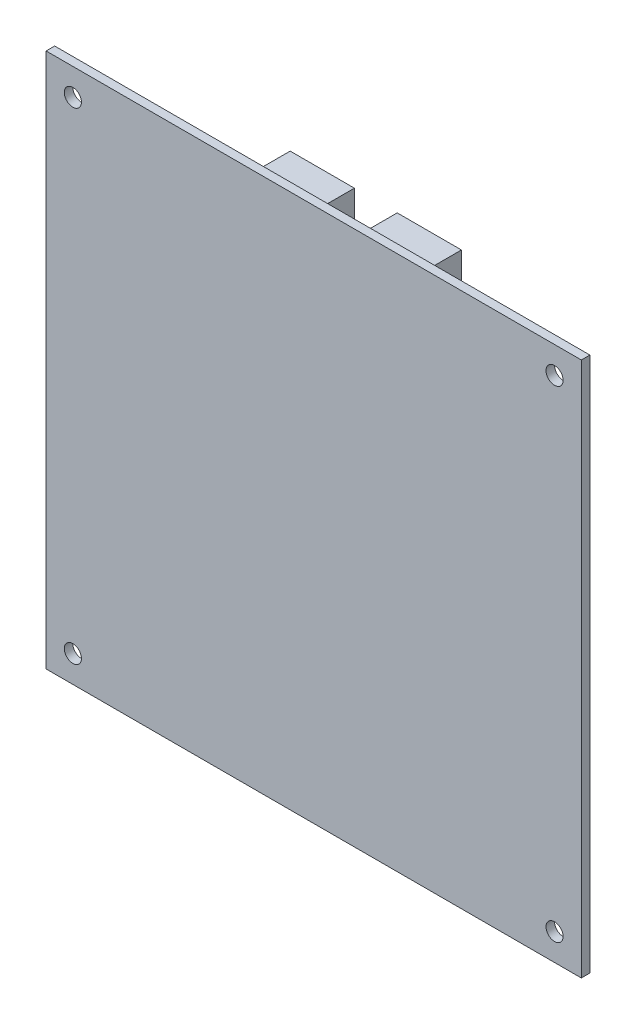
ISO-10303-21;
HEADER;
FILE_DESCRIPTION(('STEP AP214'),'2;1');
FILE_NAME('part.step','',(''),(''),'','','');
FILE_SCHEMA(('AUTOMOTIVE_DESIGN { 1 0 10303 214 1 1 1 1 }'));
ENDSEC;
DATA;
#1=APPLICATION_CONTEXT('core data for automotive mechanical design processes');
#2=APPLICATION_PROTOCOL_DEFINITION('international standard','automotive_design',2000,#1);
#3=PRODUCT_CONTEXT('',#1,'mechanical');
#4=PRODUCT('Part','Part','',(#3));
#5=PRODUCT_RELATED_PRODUCT_CATEGORY('part','',(#4));
#6=PRODUCT_DEFINITION_FORMATION('','',#4);
#7=PRODUCT_DEFINITION_CONTEXT('part definition',#1,'design');
#8=PRODUCT_DEFINITION('design','',#6,#7);
#9=PRODUCT_DEFINITION_SHAPE('','',#8);
#10=(LENGTH_UNIT() NAMED_UNIT(*) SI_UNIT(.MILLI.,.METRE.));
#11=(NAMED_UNIT(*) PLANE_ANGLE_UNIT() SI_UNIT($,.RADIAN.));
#12=(NAMED_UNIT(*) SI_UNIT($,.STERADIAN.) SOLID_ANGLE_UNIT());
#13=UNCERTAINTY_MEASURE_WITH_UNIT(LENGTH_MEASURE(1.E-05),#10,'distance_accuracy_value','');
#14=(GEOMETRIC_REPRESENTATION_CONTEXT(3) GLOBAL_UNCERTAINTY_ASSIGNED_CONTEXT((#13)) GLOBAL_UNIT_ASSIGNED_CONTEXT((#10,
#11,#12)) REPRESENTATION_CONTEXT('',''));
#15=CARTESIAN_POINT('',(0.,0.,0.));
#16=DIRECTION('',(0.,0.,1.));
#17=DIRECTION('',(1.,0.,0.));
#18=AXIS2_PLACEMENT_3D('',#15,#16,#17);
#19=CARTESIAN_POINT('',(0.,0.,0.));
#20=DIRECTION('',(0.,0.,1.));
#21=DIRECTION('',(1.,0.,0.));
#22=AXIS2_PLACEMENT_3D('',#19,#20,#21);
#23=PLANE('',#22);
#24=DIRECTION('',(0.,-1.,0.));
#25=VECTOR('',#24,1.);
#26=CARTESIAN_POINT('',(34.,95.,0.));
#27=LINE('',#26,#25);
#28=CARTESIAN_POINT('',(34.,95.,0.));
#29=VERTEX_POINT('',#28);
#30=CARTESIAN_POINT('',(34.,85.,0.));
#31=VERTEX_POINT('',#30);
#32=EDGE_CURVE('E273',#29,#31,#27,.T.);
#33=ORIENTED_EDGE('',*,*,#32,.T.);
#34=DIRECTION('',(1.,0.,0.));
#35=VECTOR('',#34,1.);
#36=CARTESIAN_POINT('',(34.,85.,0.));
#37=LINE('',#36,#35);
#38=CARTESIAN_POINT('',(46.,85.,0.));
#39=VERTEX_POINT('',#38);
#40=EDGE_CURVE('E280',#31,#39,#37,.T.);
#41=ORIENTED_EDGE('',*,*,#40,.T.);
#42=DIRECTION('',(0.,1.,0.));
#43=VECTOR('',#42,1.);
#44=CARTESIAN_POINT('',(46.,85.,0.));
#45=LINE('',#44,#43);
#46=CARTESIAN_POINT('',(46.,95.,0.));
#47=VERTEX_POINT('',#46);
#48=EDGE_CURVE('E281',#39,#47,#45,.T.);
#49=ORIENTED_EDGE('',*,*,#48,.T.);
#50=DIRECTION('',(-1.,0.,0.));
#51=VECTOR('',#50,1.);
#52=CARTESIAN_POINT('',(46.,95.,0.));
#53=LINE('',#52,#51);
#54=EDGE_CURVE('E283',#47,#29,#53,.T.);
#55=ORIENTED_EDGE('',*,*,#54,.T.);
#56=EDGE_LOOP('',(#33,#41,#49,#55));
#57=FACE_BOUND('',#56,.T.);
#58=DIRECTION('',(0.,-1.,0.));
#59=VECTOR('',#58,1.);
#60=CARTESIAN_POINT('',(34.,73.,0.));
#61=LINE('',#60,#59);
#62=CARTESIAN_POINT('',(34.,73.,0.));
#63=VERTEX_POINT('',#62);
#64=CARTESIAN_POINT('',(34.,26.,0.));
#65=VERTEX_POINT('',#64);
#66=EDGE_CURVE('E356',#63,#65,#61,.T.);
#67=ORIENTED_EDGE('',*,*,#66,.T.);
#68=DIRECTION('',(1.,0.,0.));
#69=VECTOR('',#68,1.);
#70=CARTESIAN_POINT('',(34.,26.,0.));
#71=LINE('',#70,#69);
#72=CARTESIAN_POINT('',(66.,26.,0.));
#73=VERTEX_POINT('',#72);
#74=EDGE_CURVE('E358',#65,#73,#71,.T.);
#75=ORIENTED_EDGE('',*,*,#74,.T.);
#76=DIRECTION('',(0.,1.,0.));
#77=VECTOR('',#76,1.);
#78=CARTESIAN_POINT('',(66.,26.,0.));
#79=LINE('',#78,#77);
#80=CARTESIAN_POINT('',(66.,73.,0.));
#81=VERTEX_POINT('',#80);
#82=EDGE_CURVE('E361',#73,#81,#79,.T.);
#83=ORIENTED_EDGE('',*,*,#82,.T.);
#84=DIRECTION('',(-1.,0.,0.));
#85=VECTOR('',#84,1.);
#86=CARTESIAN_POINT('',(66.,73.,0.));
#87=LINE('',#86,#85);
#88=EDGE_CURVE('E368',#81,#63,#87,.T.);
#89=ORIENTED_EDGE('',*,*,#88,.T.);
#90=EDGE_LOOP('',(#67,#75,#83,#89));
#91=FACE_BOUND('',#90,.T.);
#92=CARTESIAN_POINT('',(95.,95.,0.));
#93=DIRECTION('',(0.,0.,1.));
#94=DIRECTION('',(1.,0.,0.));
#95=AXIS2_PLACEMENT_3D('',#92,#93,#94);
#96=CIRCLE('',#95,1.6);
#97=CARTESIAN_POINT('',(96.6,95.,0.));
#98=VERTEX_POINT('',#97);
#99=EDGE_CURVE('E485',#98,#98,#96,.T.);
#100=ORIENTED_EDGE('',*,*,#99,.T.);
#101=EDGE_LOOP('',(#100));
#102=FACE_BOUND('',#101,.T.);
#103=CARTESIAN_POINT('',(5.,95.,0.));
#104=DIRECTION('',(0.,0.,1.));
#105=DIRECTION('',(1.,0.,0.));
#106=AXIS2_PLACEMENT_3D('',#103,#104,#105);
#107=CIRCLE('',#106,1.6);
#108=CARTESIAN_POINT('',(6.6,95.,0.));
#109=VERTEX_POINT('',#108);
#110=EDGE_CURVE('E490',#109,#109,#107,.T.);
#111=ORIENTED_EDGE('',*,*,#110,.T.);
#112=EDGE_LOOP('',(#111));
#113=FACE_BOUND('',#112,.T.);
#114=CARTESIAN_POINT('',(95.,5.,0.));
#115=DIRECTION('',(0.,0.,1.));
#116=DIRECTION('',(1.,0.,0.));
#117=AXIS2_PLACEMENT_3D('',#114,#115,#116);
#118=CIRCLE('',#117,1.6);
#119=CARTESIAN_POINT('',(96.6,5.,0.));
#120=VERTEX_POINT('',#119);
#121=EDGE_CURVE('E494',#120,#120,#118,.T.);
#122=ORIENTED_EDGE('',*,*,#121,.T.);
#123=EDGE_LOOP('',(#122));
#124=FACE_BOUND('',#123,.T.);
#125=CARTESIAN_POINT('',(5.,5.,0.));
#126=DIRECTION('',(0.,0.,1.));
#127=DIRECTION('',(1.,0.,0.));
#128=AXIS2_PLACEMENT_3D('',#125,#126,#127);
#129=CIRCLE('',#128,1.6);
#130=CARTESIAN_POINT('',(6.6,5.,0.));
#131=VERTEX_POINT('',#130);
#132=EDGE_CURVE('E504',#131,#131,#129,.T.);
#133=ORIENTED_EDGE('',*,*,#132,.T.);
#134=EDGE_LOOP('',(#133));
#135=FACE_BOUND('',#134,.T.);
#136=DIRECTION('',(0.,-1.,0.));
#137=VECTOR('',#136,1.);
#138=CARTESIAN_POINT('',(0.,100.,0.));
#139=LINE('',#138,#137);
#140=CARTESIAN_POINT('',(0.,100.,0.));
#141=VERTEX_POINT('',#140);
#142=CARTESIAN_POINT('',(0.,0.,0.));
#143=VERTEX_POINT('',#142);
#144=EDGE_CURVE('E512',#141,#143,#139,.T.);
#145=ORIENTED_EDGE('',*,*,#144,.F.);
#146=DIRECTION('',(-1.,0.,0.));
#147=VECTOR('',#146,1.);
#148=CARTESIAN_POINT('',(100.,100.,0.));
#149=LINE('',#148,#147);
#150=CARTESIAN_POINT('',(100.,100.,0.));
#151=VERTEX_POINT('',#150);
#152=EDGE_CURVE('E520',#151,#141,#149,.T.);
#153=ORIENTED_EDGE('',*,*,#152,.F.);
#154=DIRECTION('',(0.,1.,0.));
#155=VECTOR('',#154,1.);
#156=CARTESIAN_POINT('',(100.,0.,0.));
#157=LINE('',#156,#155);
#158=CARTESIAN_POINT('',(100.,0.,0.));
#159=VERTEX_POINT('',#158);
#160=EDGE_CURVE('E536',#159,#151,#157,.T.);
#161=ORIENTED_EDGE('',*,*,#160,.F.);
#162=DIRECTION('',(1.,0.,0.));
#163=VECTOR('',#162,1.);
#164=CARTESIAN_POINT('',(0.,0.,0.));
#165=LINE('',#164,#163);
#166=EDGE_CURVE('E531',#143,#159,#165,.T.);
#167=ORIENTED_EDGE('',*,*,#166,.F.);
#168=EDGE_LOOP('',(#145,#153,#161,#167));
#169=FACE_BOUND('',#168,.T.);
#170=DIRECTION('',(-1.,0.,0.));
#171=VECTOR('',#170,1.);
#172=CARTESIAN_POINT('',(30.,78.,0.));
#173=LINE('',#172,#171);
#174=CARTESIAN_POINT('',(30.,78.,0.));
#175=VERTEX_POINT('',#174);
#176=CARTESIAN_POINT('',(26.,78.,0.));
#177=VERTEX_POINT('',#176);
#178=EDGE_CURVE('E451',#175,#177,#173,.T.);
#179=ORIENTED_EDGE('',*,*,#178,.T.);
#180=DIRECTION('',(0.,-1.,0.));
#181=VECTOR('',#180,1.);
#182=CARTESIAN_POINT('',(26.,78.,0.));
#183=LINE('',#182,#181);
#184=CARTESIAN_POINT('',(26.,20.,0.));
#185=VERTEX_POINT('',#184);
#186=EDGE_CURVE('E437',#177,#185,#183,.T.);
#187=ORIENTED_EDGE('',*,*,#186,.T.);
#188=DIRECTION('',(1.,0.,0.));
#189=VECTOR('',#188,1.);
#190=CARTESIAN_POINT('',(26.,20.,0.));
#191=LINE('',#190,#189);
#192=CARTESIAN_POINT('',(30.,20.,0.));
#193=VERTEX_POINT('',#192);
#194=EDGE_CURVE('E445',#185,#193,#191,.T.);
#195=ORIENTED_EDGE('',*,*,#194,.T.);
#196=DIRECTION('',(0.,1.,0.));
#197=VECTOR('',#196,1.);
#198=CARTESIAN_POINT('',(30.,20.,0.));
#199=LINE('',#198,#197);
#200=EDGE_CURVE('E447',#193,#175,#199,.T.);
#201=ORIENTED_EDGE('',*,*,#200,.T.);
#202=EDGE_LOOP('',(#179,#187,#195,#201));
#203=FACE_BOUND('',#202,.T.);
#204=DIRECTION('',(0.,-1.,0.));
#205=VECTOR('',#204,1.);
#206=CARTESIAN_POINT('',(70.,78.,0.));
#207=LINE('',#206,#205);
#208=CARTESIAN_POINT('',(70.,78.,0.));
#209=VERTEX_POINT('',#208);
#210=CARTESIAN_POINT('',(70.,20.,0.));
#211=VERTEX_POINT('',#210);
#212=EDGE_CURVE('E397',#209,#211,#207,.T.);
#213=ORIENTED_EDGE('',*,*,#212,.T.);
#214=DIRECTION('',(1.,0.,0.));
#215=VECTOR('',#214,1.);
#216=CARTESIAN_POINT('',(70.,20.,0.));
#217=LINE('',#216,#215);
#218=CARTESIAN_POINT('',(74.,20.,0.));
#219=VERTEX_POINT('',#218);
#220=EDGE_CURVE('E400',#211,#219,#217,.T.);
#221=ORIENTED_EDGE('',*,*,#220,.T.);
#222=DIRECTION('',(0.,1.,0.));
#223=VECTOR('',#222,1.);
#224=CARTESIAN_POINT('',(74.,20.,0.));
#225=LINE('',#224,#223);
#226=CARTESIAN_POINT('',(74.,78.,0.));
#227=VERTEX_POINT('',#226);
#228=EDGE_CURVE('E404',#219,#227,#225,.T.);
#229=ORIENTED_EDGE('',*,*,#228,.T.);
#230=DIRECTION('',(-1.,0.,0.));
#231=VECTOR('',#230,1.);
#232=CARTESIAN_POINT('',(74.,78.,0.));
#233=LINE('',#232,#231);
#234=EDGE_CURVE('E407',#227,#209,#233,.T.);
#235=ORIENTED_EDGE('',*,*,#234,.T.);
#236=EDGE_LOOP('',(#213,#221,#229,#235));
#237=FACE_BOUND('',#236,.T.);
#238=DIRECTION('',(0.,-1.,0.));
#239=VECTOR('',#238,1.);
#240=CARTESIAN_POINT('',(40.,13.,0.));
#241=LINE('',#240,#239);
#242=CARTESIAN_POINT('',(40.,13.,0.));
#243=VERTEX_POINT('',#242);
#244=CARTESIAN_POINT('',(40.,3.,0.));
#245=VERTEX_POINT('',#244);
#246=EDGE_CURVE('E312',#243,#245,#241,.T.);
#247=ORIENTED_EDGE('',*,*,#246,.T.);
#248=DIRECTION('',(1.,0.,0.));
#249=VECTOR('',#248,1.);
#250=CARTESIAN_POINT('',(40.,3.,0.));
#251=LINE('',#250,#249);
#252=CARTESIAN_POINT('',(60.,3.,0.));
#253=VERTEX_POINT('',#252);
#254=EDGE_CURVE('E318',#245,#253,#251,.T.);
#255=ORIENTED_EDGE('',*,*,#254,.T.);
#256=DIRECTION('',(0.,1.,0.));
#257=VECTOR('',#256,1.);
#258=CARTESIAN_POINT('',(60.,3.,0.));
#259=LINE('',#258,#257);
#260=CARTESIAN_POINT('',(60.,13.,0.));
#261=VERTEX_POINT('',#260);
#262=EDGE_CURVE('E325',#253,#261,#259,.T.);
#263=ORIENTED_EDGE('',*,*,#262,.T.);
#264=DIRECTION('',(-1.,0.,0.));
#265=VECTOR('',#264,1.);
#266=CARTESIAN_POINT('',(60.,13.,0.));
#267=LINE('',#266,#265);
#268=EDGE_CURVE('E324',#261,#243,#267,.T.);
#269=ORIENTED_EDGE('',*,*,#268,.T.);
#270=EDGE_LOOP('',(#247,#255,#263,#269));
#271=FACE_BOUND('',#270,.T.);
#272=DIRECTION('',(0.,-1.,0.));
#273=VECTOR('',#272,1.);
#274=CARTESIAN_POINT('',(54.,95.,0.));
#275=LINE('',#274,#273);
#276=CARTESIAN_POINT('',(54.,95.,0.));
#277=VERTEX_POINT('',#276);
#278=CARTESIAN_POINT('',(54.,85.,0.));
#279=VERTEX_POINT('',#278);
#280=EDGE_CURVE('E61',#277,#279,#275,.T.);
#281=ORIENTED_EDGE('',*,*,#280,.T.);
#282=DIRECTION('',(1.,0.,0.));
#283=VECTOR('',#282,1.);
#284=CARTESIAN_POINT('',(54.,85.,0.));
#285=LINE('',#284,#283);
#286=CARTESIAN_POINT('',(66.,85.,0.));
#287=VERTEX_POINT('',#286);
#288=EDGE_CURVE('E65',#279,#287,#285,.T.);
#289=ORIENTED_EDGE('',*,*,#288,.T.);
#290=DIRECTION('',(0.,1.,0.));
#291=VECTOR('',#290,1.);
#292=CARTESIAN_POINT('',(66.,85.,0.));
#293=LINE('',#292,#291);
#294=CARTESIAN_POINT('',(66.,95.,0.));
#295=VERTEX_POINT('',#294);
#296=EDGE_CURVE('E227',#287,#295,#293,.T.);
#297=ORIENTED_EDGE('',*,*,#296,.T.);
#298=DIRECTION('',(-1.,0.,0.));
#299=VECTOR('',#298,1.);
#300=CARTESIAN_POINT('',(66.,95.,0.));
#301=LINE('',#300,#299);
#302=EDGE_CURVE('E230',#295,#277,#301,.T.);
#303=ORIENTED_EDGE('',*,*,#302,.T.);
#304=EDGE_LOOP('',(#281,#289,#297,#303));
#305=FACE_BOUND('',#304,.T.);
#306=ADVANCED_FACE('F44',(#57,#91,#102,#113,#124,#135,#169,#203,#237,#271,#305),#23,.F.);
#307=CARTESIAN_POINT('',(0.,0.,1.6));
#308=DIRECTION('',(0.,0.,1.));
#309=DIRECTION('',(1.,0.,0.));
#310=AXIS2_PLACEMENT_3D('',#307,#308,#309);
#311=PLANE('',#310);
#312=CARTESIAN_POINT('',(5.,95.,1.6));
#313=DIRECTION('',(0.,0.,1.));
#314=DIRECTION('',(1.,0.,0.));
#315=AXIS2_PLACEMENT_3D('',#312,#313,#314);
#316=CIRCLE('',#315,1.6);
#317=CARTESIAN_POINT('',(6.6,95.,1.6));
#318=VERTEX_POINT('',#317);
#319=EDGE_CURVE('E491',#318,#318,#316,.T.);
#320=ORIENTED_EDGE('',*,*,#319,.F.);
#321=EDGE_LOOP('',(#320));
#322=FACE_BOUND('',#321,.T.);
#323=CARTESIAN_POINT('',(5.,5.,1.6));
#324=DIRECTION('',(0.,0.,1.));
#325=DIRECTION('',(1.,0.,0.));
#326=AXIS2_PLACEMENT_3D('',#323,#324,#325);
#327=CIRCLE('',#326,1.6);
#328=CARTESIAN_POINT('',(6.6,5.,1.6));
#329=VERTEX_POINT('',#328);
#330=EDGE_CURVE('E507',#329,#329,#327,.T.);
#331=ORIENTED_EDGE('',*,*,#330,.F.);
#332=EDGE_LOOP('',(#331));
#333=FACE_BOUND('',#332,.T.);
#334=DIRECTION('',(0.,-1.,0.));
#335=VECTOR('',#334,1.);
#336=CARTESIAN_POINT('',(0.,100.,1.6));
#337=LINE('',#336,#335);
#338=CARTESIAN_POINT('',(0.,100.,1.6));
#339=VERTEX_POINT('',#338);
#340=CARTESIAN_POINT('',(0.,0.,1.6));
#341=VERTEX_POINT('',#340);
#342=EDGE_CURVE('E513',#339,#341,#337,.T.);
#343=ORIENTED_EDGE('',*,*,#342,.T.);
#344=DIRECTION('',(1.,0.,0.));
#345=VECTOR('',#344,1.);
#346=CARTESIAN_POINT('',(0.,0.,1.6));
#347=LINE('',#346,#345);
#348=CARTESIAN_POINT('',(100.,0.,1.6));
#349=VERTEX_POINT('',#348);
#350=EDGE_CURVE('E518',#341,#349,#347,.T.);
#351=ORIENTED_EDGE('',*,*,#350,.T.);
#352=DIRECTION('',(0.,1.,0.));
#353=VECTOR('',#352,1.);
#354=CARTESIAN_POINT('',(100.,0.,1.6));
#355=LINE('',#354,#353);
#356=CARTESIAN_POINT('',(100.,100.,1.6));
#357=VERTEX_POINT('',#356);
#358=EDGE_CURVE('E524',#349,#357,#355,.T.);
#359=ORIENTED_EDGE('',*,*,#358,.T.);
#360=DIRECTION('',(-1.,0.,0.));
#361=VECTOR('',#360,1.);
#362=CARTESIAN_POINT('',(100.,100.,1.6));
#363=LINE('',#362,#361);
#364=EDGE_CURVE('E528',#357,#339,#363,.T.);
#365=ORIENTED_EDGE('',*,*,#364,.T.);
#366=EDGE_LOOP('',(#343,#351,#359,#365));
#367=FACE_BOUND('',#366,.T.);
#368=CARTESIAN_POINT('',(95.,5.,1.6));
#369=DIRECTION('',(0.,0.,1.));
#370=DIRECTION('',(1.,0.,0.));
#371=AXIS2_PLACEMENT_3D('',#368,#369,#370);
#372=CIRCLE('',#371,1.6);
#373=CARTESIAN_POINT('',(96.6,5.,1.6));
#374=VERTEX_POINT('',#373);
#375=EDGE_CURVE('E496',#374,#374,#372,.T.);
#376=ORIENTED_EDGE('',*,*,#375,.F.);
#377=EDGE_LOOP('',(#376));
#378=FACE_BOUND('',#377,.T.);
#379=CARTESIAN_POINT('',(95.,95.,1.6));
#380=DIRECTION('',(0.,0.,1.));
#381=DIRECTION('',(1.,0.,0.));
#382=AXIS2_PLACEMENT_3D('',#379,#380,#381);
#383=CIRCLE('',#382,1.6);
#384=CARTESIAN_POINT('',(96.6,95.,1.6));
#385=VERTEX_POINT('',#384);
#386=EDGE_CURVE('E483',#385,#385,#383,.T.);
#387=ORIENTED_EDGE('',*,*,#386,.F.);
#388=EDGE_LOOP('',(#387));
#389=FACE_BOUND('',#388,.T.);
#390=ADVANCED_FACE('F566',(#322,#333,#367,#378,#389),#311,.T.);
#391=CARTESIAN_POINT('',(0.,100.,1.6));
#392=DIRECTION('',(1.,0.,0.));
#393=DIRECTION('',(0.,0.,-1.));
#394=AXIS2_PLACEMENT_3D('',#391,#392,#393);
#395=PLANE('',#394);
#396=ORIENTED_EDGE('',*,*,#144,.T.);
#397=DIRECTION('',(0.,0.,-1.));
#398=VECTOR('',#397,1.);
#399=CARTESIAN_POINT('',(0.,0.,1.6));
#400=LINE('',#399,#398);
#401=EDGE_CURVE('E11',#341,#143,#400,.T.);
#402=ORIENTED_EDGE('',*,*,#401,.F.);
#403=ORIENTED_EDGE('',*,*,#342,.F.);
#404=DIRECTION('',(0.,0.,-1.));
#405=VECTOR('',#404,1.);
#406=CARTESIAN_POINT('',(0.,100.,1.6));
#407=LINE('',#406,#405);
#408=EDGE_CURVE('E530',#339,#141,#407,.T.);
#409=ORIENTED_EDGE('',*,*,#408,.T.);
#410=EDGE_LOOP('',(#396,#402,#403,#409));
#411=FACE_BOUND('',#410,.T.);
#412=ADVANCED_FACE('F50',(#411),#395,.F.);
#413=CARTESIAN_POINT('',(0.,0.,1.6));
#414=DIRECTION('',(0.,1.,0.));
#415=DIRECTION('',(0.,0.,1.));
#416=AXIS2_PLACEMENT_3D('',#413,#414,#415);
#417=PLANE('',#416);
#418=ORIENTED_EDGE('',*,*,#166,.T.);
#419=DIRECTION('',(0.,0.,-1.));
#420=VECTOR('',#419,1.);
#421=CARTESIAN_POINT('',(100.,0.,1.6));
#422=LINE('',#421,#420);
#423=EDGE_CURVE('E53',#349,#159,#422,.T.);
#424=ORIENTED_EDGE('',*,*,#423,.F.);
#425=ORIENTED_EDGE('',*,*,#350,.F.);
#426=ORIENTED_EDGE('',*,*,#401,.T.);
#427=EDGE_LOOP('',(#418,#424,#425,#426));
#428=FACE_BOUND('',#427,.T.);
#429=ADVANCED_FACE('F568',(#428),#417,.F.);
#430=CARTESIAN_POINT('',(100.,0.,1.6));
#431=DIRECTION('',(-1.,0.,0.));
#432=DIRECTION('',(0.,0.,1.));
#433=AXIS2_PLACEMENT_3D('',#430,#431,#432);
#434=PLANE('',#433);
#435=ORIENTED_EDGE('',*,*,#160,.T.);
#436=DIRECTION('',(0.,0.,-1.));
#437=VECTOR('',#436,1.);
#438=CARTESIAN_POINT('',(100.,100.,1.6));
#439=LINE('',#438,#437);
#440=EDGE_CURVE('E542',#357,#151,#439,.T.);
#441=ORIENTED_EDGE('',*,*,#440,.F.);
#442=ORIENTED_EDGE('',*,*,#358,.F.);
#443=ORIENTED_EDGE('',*,*,#423,.T.);
#444=EDGE_LOOP('',(#435,#441,#442,#443));
#445=FACE_BOUND('',#444,.T.);
#446=ADVANCED_FACE('F554',(#445),#434,.F.);
#447=CARTESIAN_POINT('',(100.,100.,1.6));
#448=DIRECTION('',(0.,-1.,0.));
#449=DIRECTION('',(0.,0.,-1.));
#450=AXIS2_PLACEMENT_3D('',#447,#448,#449);
#451=PLANE('',#450);
#452=ORIENTED_EDGE('',*,*,#152,.T.);
#453=ORIENTED_EDGE('',*,*,#408,.F.);
#454=ORIENTED_EDGE('',*,*,#364,.F.);
#455=ORIENTED_EDGE('',*,*,#440,.T.);
#456=EDGE_LOOP('',(#452,#453,#454,#455));
#457=FACE_BOUND('',#456,.T.);
#458=ADVANCED_FACE('F562',(#457),#451,.F.);
#459=CARTESIAN_POINT('',(5.,5.,1.6));
#460=DIRECTION('',(0.,0.,-1.));
#461=DIRECTION('',(-1.,0.,0.));
#462=AXIS2_PLACEMENT_3D('',#459,#460,#461);
#463=CYLINDRICAL_SURFACE('',#462,1.6);
#464=ORIENTED_EDGE('',*,*,#330,.T.);
#465=EDGE_LOOP('',(#464));
#466=FACE_BOUND('',#465,.T.);
#467=ORIENTED_EDGE('',*,*,#132,.F.);
#468=EDGE_LOOP('',(#467));
#469=FACE_BOUND('',#468,.T.);
#470=ADVANCED_FACE('F591',(#466,#469),#463,.F.);
#471=CARTESIAN_POINT('',(95.,5.,1.6));
#472=DIRECTION('',(0.,0.,-1.));
#473=DIRECTION('',(-1.,0.,0.));
#474=AXIS2_PLACEMENT_3D('',#471,#472,#473);
#475=CYLINDRICAL_SURFACE('',#474,1.6);
#476=ORIENTED_EDGE('',*,*,#375,.T.);
#477=EDGE_LOOP('',(#476));
#478=FACE_BOUND('',#477,.T.);
#479=ORIENTED_EDGE('',*,*,#121,.F.);
#480=EDGE_LOOP('',(#479));
#481=FACE_BOUND('',#480,.T.);
#482=ADVANCED_FACE('F594',(#478,#481),#475,.F.);
#483=CARTESIAN_POINT('',(5.,95.,1.6));
#484=DIRECTION('',(0.,0.,-1.));
#485=DIRECTION('',(-1.,0.,0.));
#486=AXIS2_PLACEMENT_3D('',#483,#484,#485);
#487=CYLINDRICAL_SURFACE('',#486,1.6);
#488=ORIENTED_EDGE('',*,*,#319,.T.);
#489=EDGE_LOOP('',(#488));
#490=FACE_BOUND('',#489,.T.);
#491=ORIENTED_EDGE('',*,*,#110,.F.);
#492=EDGE_LOOP('',(#491));
#493=FACE_BOUND('',#492,.T.);
#494=ADVANCED_FACE('F599',(#490,#493),#487,.F.);
#495=CARTESIAN_POINT('',(95.,95.,1.6));
#496=DIRECTION('',(0.,0.,-1.));
#497=DIRECTION('',(-1.,0.,0.));
#498=AXIS2_PLACEMENT_3D('',#495,#496,#497);
#499=CYLINDRICAL_SURFACE('',#498,1.6);
#500=ORIENTED_EDGE('',*,*,#386,.T.);
#501=EDGE_LOOP('',(#500));
#502=FACE_BOUND('',#501,.T.);
#503=ORIENTED_EDGE('',*,*,#99,.F.);
#504=EDGE_LOOP('',(#503));
#505=FACE_BOUND('',#504,.T.);
#506=ADVANCED_FACE('F610',(#502,#505),#499,.F.);
#507=CARTESIAN_POINT('',(26.,78.,0.));
#508=DIRECTION('',(1.,0.,0.));
#509=DIRECTION('',(0.,0.,-1.));
#510=AXIS2_PLACEMENT_3D('',#507,#508,#509);
#511=PLANE('',#510);
#512=DIRECTION('',(0.,-1.,0.));
#513=VECTOR('',#512,1.);
#514=CARTESIAN_POINT('',(26.,78.,-8.));
#515=LINE('',#514,#513);
#516=CARTESIAN_POINT('',(26.,78.,-8.));
#517=VERTEX_POINT('',#516);
#518=CARTESIAN_POINT('',(26.,20.,-8.));
#519=VERTEX_POINT('',#518);
#520=EDGE_CURVE('E440',#517,#519,#515,.T.);
#521=ORIENTED_EDGE('',*,*,#520,.T.);
#522=DIRECTION('',(0.,0.,-1.));
#523=VECTOR('',#522,1.);
#524=CARTESIAN_POINT('',(26.,20.,0.));
#525=LINE('',#524,#523);
#526=EDGE_CURVE('E476',#185,#519,#525,.T.);
#527=ORIENTED_EDGE('',*,*,#526,.F.);
#528=ORIENTED_EDGE('',*,*,#186,.F.);
#529=DIRECTION('',(0.,0.,-1.));
#530=VECTOR('',#529,1.);
#531=CARTESIAN_POINT('',(26.,78.,0.));
#532=LINE('',#531,#530);
#533=EDGE_CURVE('E455',#177,#517,#532,.T.);
#534=ORIENTED_EDGE('',*,*,#533,.T.);
#535=EDGE_LOOP('',(#521,#527,#528,#534));
#536=FACE_BOUND('',#535,.T.);
#537=ADVANCED_FACE('F611',(#536),#511,.F.);
#538=CARTESIAN_POINT('',(26.,20.,0.));
#539=DIRECTION('',(0.,1.,0.));
#540=DIRECTION('',(0.,0.,1.));
#541=AXIS2_PLACEMENT_3D('',#538,#539,#540);
#542=PLANE('',#541);
#543=DIRECTION('',(1.,0.,0.));
#544=VECTOR('',#543,1.);
#545=CARTESIAN_POINT('',(26.,20.,-8.));
#546=LINE('',#545,#544);
#547=CARTESIAN_POINT('',(30.,20.,-8.));
#548=VERTEX_POINT('',#547);
#549=EDGE_CURVE('E459',#519,#548,#546,.T.);
#550=ORIENTED_EDGE('',*,*,#549,.T.);
#551=DIRECTION('',(0.,0.,-1.));
#552=VECTOR('',#551,1.);
#553=CARTESIAN_POINT('',(30.,20.,0.));
#554=LINE('',#553,#552);
#555=EDGE_CURVE('E475',#193,#548,#554,.T.);
#556=ORIENTED_EDGE('',*,*,#555,.F.);
#557=ORIENTED_EDGE('',*,*,#194,.F.);
#558=ORIENTED_EDGE('',*,*,#526,.T.);
#559=EDGE_LOOP('',(#550,#556,#557,#558));
#560=FACE_BOUND('',#559,.T.);
#561=ADVANCED_FACE('F615',(#560),#542,.F.);
#562=CARTESIAN_POINT('',(30.,20.,0.));
#563=DIRECTION('',(-1.,0.,0.));
#564=DIRECTION('',(0.,0.,1.));
#565=AXIS2_PLACEMENT_3D('',#562,#563,#564);
#566=PLANE('',#565);
#567=DIRECTION('',(0.,1.,0.));
#568=VECTOR('',#567,1.);
#569=CARTESIAN_POINT('',(30.,20.,-8.));
#570=LINE('',#569,#568);
#571=CARTESIAN_POINT('',(30.,78.,-8.));
#572=VERTEX_POINT('',#571);
#573=EDGE_CURVE('E462',#548,#572,#570,.T.);
#574=ORIENTED_EDGE('',*,*,#573,.T.);
#575=DIRECTION('',(0.,0.,-1.));
#576=VECTOR('',#575,1.);
#577=CARTESIAN_POINT('',(30.,78.,0.));
#578=LINE('',#577,#576);
#579=EDGE_CURVE('E470',#175,#572,#578,.T.);
#580=ORIENTED_EDGE('',*,*,#579,.F.);
#581=ORIENTED_EDGE('',*,*,#200,.F.);
#582=ORIENTED_EDGE('',*,*,#555,.T.);
#583=EDGE_LOOP('',(#574,#580,#581,#582));
#584=FACE_BOUND('',#583,.T.);
#585=ADVANCED_FACE('F618',(#584),#566,.F.);
#586=CARTESIAN_POINT('',(30.,78.,0.));
#587=DIRECTION('',(0.,-1.,0.));
#588=DIRECTION('',(0.,0.,-1.));
#589=AXIS2_PLACEMENT_3D('',#586,#587,#588);
#590=PLANE('',#589);
#591=DIRECTION('',(-1.,0.,0.));
#592=VECTOR('',#591,1.);
#593=CARTESIAN_POINT('',(30.,78.,-8.));
#594=LINE('',#593,#592);
#595=EDGE_CURVE('E444',#572,#517,#594,.T.);
#596=ORIENTED_EDGE('',*,*,#595,.T.);
#597=ORIENTED_EDGE('',*,*,#533,.F.);
#598=ORIENTED_EDGE('',*,*,#178,.F.);
#599=ORIENTED_EDGE('',*,*,#579,.T.);
#600=EDGE_LOOP('',(#596,#597,#598,#599));
#601=FACE_BOUND('',#600,.T.);
#602=ADVANCED_FACE('F621',(#601),#590,.F.);
#603=CARTESIAN_POINT('',(0.,0.,-8.));
#604=DIRECTION('',(0.,0.,1.));
#605=DIRECTION('',(1.,0.,0.));
#606=AXIS2_PLACEMENT_3D('',#603,#604,#605);
#607=PLANE('',#606);
#608=ORIENTED_EDGE('',*,*,#520,.F.);
#609=ORIENTED_EDGE('',*,*,#595,.F.);
#610=ORIENTED_EDGE('',*,*,#573,.F.);
#611=ORIENTED_EDGE('',*,*,#549,.F.);
#612=EDGE_LOOP('',(#608,#609,#610,#611));
#613=FACE_BOUND('',#612,.T.);
#614=ADVANCED_FACE('F627',(#613),#607,.F.);
#615=CARTESIAN_POINT('',(70.,78.,0.));
#616=DIRECTION('',(1.,0.,0.));
#617=DIRECTION('',(0.,0.,-1.));
#618=AXIS2_PLACEMENT_3D('',#615,#616,#617);
#619=PLANE('',#618);
#620=DIRECTION('',(0.,-1.,0.));
#621=VECTOR('',#620,1.);
#622=CARTESIAN_POINT('',(70.,78.,-8.));
#623=LINE('',#622,#621);
#624=CARTESIAN_POINT('',(70.,78.,-8.));
#625=VERTEX_POINT('',#624);
#626=CARTESIAN_POINT('',(70.,20.,-8.));
#627=VERTEX_POINT('',#626);
#628=EDGE_CURVE('E396',#625,#627,#623,.T.);
#629=ORIENTED_EDGE('',*,*,#628,.T.);
#630=DIRECTION('',(0.,0.,-1.));
#631=VECTOR('',#630,1.);
#632=CARTESIAN_POINT('',(70.,20.,0.));
#633=LINE('',#632,#631);
#634=EDGE_CURVE('E433',#211,#627,#633,.T.);
#635=ORIENTED_EDGE('',*,*,#634,.F.);
#636=ORIENTED_EDGE('',*,*,#212,.F.);
#637=DIRECTION('',(0.,0.,-1.));
#638=VECTOR('',#637,1.);
#639=CARTESIAN_POINT('',(70.,78.,0.));
#640=LINE('',#639,#638);
#641=EDGE_CURVE('E410',#209,#625,#640,.T.);
#642=ORIENTED_EDGE('',*,*,#641,.T.);
#643=EDGE_LOOP('',(#629,#635,#636,#642));
#644=FACE_BOUND('',#643,.T.);
#645=ADVANCED_FACE('F631',(#644),#619,.F.);
#646=CARTESIAN_POINT('',(70.,20.,0.));
#647=DIRECTION('',(0.,1.,0.));
#648=DIRECTION('',(0.,0.,1.));
#649=AXIS2_PLACEMENT_3D('',#646,#647,#648);
#650=PLANE('',#649);
#651=DIRECTION('',(1.,0.,0.));
#652=VECTOR('',#651,1.);
#653=CARTESIAN_POINT('',(70.,20.,-8.));
#654=LINE('',#653,#652);
#655=CARTESIAN_POINT('',(74.,20.,-8.));
#656=VERTEX_POINT('',#655);
#657=EDGE_CURVE('E413',#627,#656,#654,.T.);
#658=ORIENTED_EDGE('',*,*,#657,.T.);
#659=DIRECTION('',(0.,0.,-1.));
#660=VECTOR('',#659,1.);
#661=CARTESIAN_POINT('',(74.,20.,0.));
#662=LINE('',#661,#660);
#663=EDGE_CURVE('E427',#219,#656,#662,.T.);
#664=ORIENTED_EDGE('',*,*,#663,.F.);
#665=ORIENTED_EDGE('',*,*,#220,.F.);
#666=ORIENTED_EDGE('',*,*,#634,.T.);
#667=EDGE_LOOP('',(#658,#664,#665,#666));
#668=FACE_BOUND('',#667,.T.);
#669=ADVANCED_FACE('F635',(#668),#650,.F.);
#670=CARTESIAN_POINT('',(74.,20.,0.));
#671=DIRECTION('',(-1.,0.,0.));
#672=DIRECTION('',(0.,0.,1.));
#673=AXIS2_PLACEMENT_3D('',#670,#671,#672);
#674=PLANE('',#673);
#675=DIRECTION('',(0.,1.,0.));
#676=VECTOR('',#675,1.);
#677=CARTESIAN_POINT('',(74.,20.,-8.));
#678=LINE('',#677,#676);
#679=CARTESIAN_POINT('',(74.,78.,-8.));
#680=VERTEX_POINT('',#679);
#681=EDGE_CURVE('E417',#656,#680,#678,.T.);
#682=ORIENTED_EDGE('',*,*,#681,.T.);
#683=DIRECTION('',(0.,0.,-1.));
#684=VECTOR('',#683,1.);
#685=CARTESIAN_POINT('',(74.,78.,0.));
#686=LINE('',#685,#684);
#687=EDGE_CURVE('E422',#227,#680,#686,.T.);
#688=ORIENTED_EDGE('',*,*,#687,.F.);
#689=ORIENTED_EDGE('',*,*,#228,.F.);
#690=ORIENTED_EDGE('',*,*,#663,.T.);
#691=EDGE_LOOP('',(#682,#688,#689,#690));
#692=FACE_BOUND('',#691,.T.);
#693=ADVANCED_FACE('F640',(#692),#674,.F.);
#694=CARTESIAN_POINT('',(74.,78.,0.));
#695=DIRECTION('',(0.,-1.,0.));
#696=DIRECTION('',(0.,0.,-1.));
#697=AXIS2_PLACEMENT_3D('',#694,#695,#696);
#698=PLANE('',#697);
#699=DIRECTION('',(-1.,0.,0.));
#700=VECTOR('',#699,1.);
#701=CARTESIAN_POINT('',(74.,78.,-8.));
#702=LINE('',#701,#700);
#703=EDGE_CURVE('E402',#680,#625,#702,.T.);
#704=ORIENTED_EDGE('',*,*,#703,.T.);
#705=ORIENTED_EDGE('',*,*,#641,.F.);
#706=ORIENTED_EDGE('',*,*,#234,.F.);
#707=ORIENTED_EDGE('',*,*,#687,.T.);
#708=EDGE_LOOP('',(#704,#705,#706,#707));
#709=FACE_BOUND('',#708,.T.);
#710=ADVANCED_FACE('F641',(#709),#698,.F.);
#711=CARTESIAN_POINT('',(0.,0.,-8.));
#712=DIRECTION('',(0.,0.,1.));
#713=DIRECTION('',(1.,0.,0.));
#714=AXIS2_PLACEMENT_3D('',#711,#712,#713);
#715=PLANE('',#714);
#716=ORIENTED_EDGE('',*,*,#628,.F.);
#717=ORIENTED_EDGE('',*,*,#703,.F.);
#718=ORIENTED_EDGE('',*,*,#681,.F.);
#719=ORIENTED_EDGE('',*,*,#657,.F.);
#720=EDGE_LOOP('',(#716,#717,#718,#719));
#721=FACE_BOUND('',#720,.T.);
#722=ADVANCED_FACE('F650',(#721),#715,.F.);
#723=CARTESIAN_POINT('',(34.,73.,0.));
#724=DIRECTION('',(1.,0.,0.));
#725=DIRECTION('',(0.,0.,-1.));
#726=AXIS2_PLACEMENT_3D('',#723,#724,#725);
#727=PLANE('',#726);
#728=DIRECTION('',(0.,-1.,0.));
#729=VECTOR('',#728,1.);
#730=CARTESIAN_POINT('',(34.,73.,-16.));
#731=LINE('',#730,#729);
#732=CARTESIAN_POINT('',(34.,73.,-16.));
#733=VERTEX_POINT('',#732);
#734=CARTESIAN_POINT('',(34.,26.,-16.));
#735=VERTEX_POINT('',#734);
#736=EDGE_CURVE('E355',#733,#735,#731,.T.);
#737=ORIENTED_EDGE('',*,*,#736,.T.);
#738=DIRECTION('',(0.,0.,-1.));
#739=VECTOR('',#738,1.);
#740=CARTESIAN_POINT('',(34.,26.,0.));
#741=LINE('',#740,#739);
#742=EDGE_CURVE('E392',#65,#735,#741,.T.);
#743=ORIENTED_EDGE('',*,*,#742,.F.);
#744=ORIENTED_EDGE('',*,*,#66,.F.);
#745=DIRECTION('',(0.,0.,-1.));
#746=VECTOR('',#745,1.);
#747=CARTESIAN_POINT('',(34.,73.,0.));
#748=LINE('',#747,#746);
#749=EDGE_CURVE('E369',#63,#733,#748,.T.);
#750=ORIENTED_EDGE('',*,*,#749,.T.);
#751=EDGE_LOOP('',(#737,#743,#744,#750));
#752=FACE_BOUND('',#751,.T.);
#753=ADVANCED_FACE('F651',(#752),#727,.F.);
#754=CARTESIAN_POINT('',(34.,26.,0.));
#755=DIRECTION('',(0.,1.,0.));
#756=DIRECTION('',(0.,0.,1.));
#757=AXIS2_PLACEMENT_3D('',#754,#755,#756);
#758=PLANE('',#757);
#759=DIRECTION('',(1.,0.,0.));
#760=VECTOR('',#759,1.);
#761=CARTESIAN_POINT('',(34.,26.,-16.));
#762=LINE('',#761,#760);
#763=CARTESIAN_POINT('',(66.,26.,-16.));
#764=VERTEX_POINT('',#763);
#765=EDGE_CURVE('E373',#735,#764,#762,.T.);
#766=ORIENTED_EDGE('',*,*,#765,.T.);
#767=DIRECTION('',(0.,0.,-1.));
#768=VECTOR('',#767,1.);
#769=CARTESIAN_POINT('',(66.,26.,0.));
#770=LINE('',#769,#768);
#771=EDGE_CURVE('E389',#73,#764,#770,.T.);
#772=ORIENTED_EDGE('',*,*,#771,.F.);
#773=ORIENTED_EDGE('',*,*,#74,.F.);
#774=ORIENTED_EDGE('',*,*,#742,.T.);
#775=EDGE_LOOP('',(#766,#772,#773,#774));
#776=FACE_BOUND('',#775,.T.);
#777=ADVANCED_FACE('F654',(#776),#758,.F.);
#778=CARTESIAN_POINT('',(66.,26.,0.));
#779=DIRECTION('',(-1.,0.,0.));
#780=DIRECTION('',(0.,0.,1.));
#781=AXIS2_PLACEMENT_3D('',#778,#779,#780);
#782=PLANE('',#781);
#783=DIRECTION('',(0.,1.,0.));
#784=VECTOR('',#783,1.);
#785=CARTESIAN_POINT('',(66.,26.,-16.));
#786=LINE('',#785,#784);
#787=CARTESIAN_POINT('',(66.,73.,-16.));
#788=VERTEX_POINT('',#787);
#789=EDGE_CURVE('E376',#764,#788,#786,.T.);
#790=ORIENTED_EDGE('',*,*,#789,.T.);
#791=DIRECTION('',(0.,0.,-1.));
#792=VECTOR('',#791,1.);
#793=CARTESIAN_POINT('',(66.,73.,0.));
#794=LINE('',#793,#792);
#795=EDGE_CURVE('E383',#81,#788,#794,.T.);
#796=ORIENTED_EDGE('',*,*,#795,.F.);
#797=ORIENTED_EDGE('',*,*,#82,.F.);
#798=ORIENTED_EDGE('',*,*,#771,.T.);
#799=EDGE_LOOP('',(#790,#796,#797,#798));
#800=FACE_BOUND('',#799,.T.);
#801=ADVANCED_FACE('F658',(#800),#782,.F.);
#802=CARTESIAN_POINT('',(66.,73.,0.));
#803=DIRECTION('',(0.,-1.,0.));
#804=DIRECTION('',(0.,0.,-1.));
#805=AXIS2_PLACEMENT_3D('',#802,#803,#804);
#806=PLANE('',#805);
#807=DIRECTION('',(-1.,0.,0.));
#808=VECTOR('',#807,1.);
#809=CARTESIAN_POINT('',(66.,73.,-16.));
#810=LINE('',#809,#808);
#811=EDGE_CURVE('E360',#788,#733,#810,.T.);
#812=ORIENTED_EDGE('',*,*,#811,.T.);
#813=ORIENTED_EDGE('',*,*,#749,.F.);
#814=ORIENTED_EDGE('',*,*,#88,.F.);
#815=ORIENTED_EDGE('',*,*,#795,.T.);
#816=EDGE_LOOP('',(#812,#813,#814,#815));
#817=FACE_BOUND('',#816,.T.);
#818=ADVANCED_FACE('F664',(#817),#806,.F.);
#819=CARTESIAN_POINT('',(0.,0.,-16.));
#820=DIRECTION('',(0.,0.,1.));
#821=DIRECTION('',(1.,0.,0.));
#822=AXIS2_PLACEMENT_3D('',#819,#820,#821);
#823=PLANE('',#822);
#824=ORIENTED_EDGE('',*,*,#736,.F.);
#825=ORIENTED_EDGE('',*,*,#811,.F.);
#826=ORIENTED_EDGE('',*,*,#789,.F.);
#827=ORIENTED_EDGE('',*,*,#765,.F.);
#828=EDGE_LOOP('',(#824,#825,#826,#827));
#829=FACE_BOUND('',#828,.T.);
#830=ADVANCED_FACE('F667',(#829),#823,.F.);
#831=CARTESIAN_POINT('',(40.,13.,0.));
#832=DIRECTION('',(1.,0.,0.));
#833=DIRECTION('',(0.,0.,-1.));
#834=AXIS2_PLACEMENT_3D('',#831,#832,#833);
#835=PLANE('',#834);
#836=DIRECTION('',(0.,-1.,0.));
#837=VECTOR('',#836,1.);
#838=CARTESIAN_POINT('',(40.,13.,-12.));
#839=LINE('',#838,#837);
#840=CARTESIAN_POINT('',(40.,13.,-12.));
#841=VERTEX_POINT('',#840);
#842=CARTESIAN_POINT('',(40.,3.,-12.));
#843=VERTEX_POINT('',#842);
#844=EDGE_CURVE('E314',#841,#843,#839,.T.);
#845=ORIENTED_EDGE('',*,*,#844,.T.);
#846=DIRECTION('',(0.,0.,-1.));
#847=VECTOR('',#846,1.);
#848=CARTESIAN_POINT('',(40.,3.,0.));
#849=LINE('',#848,#847);
#850=EDGE_CURVE('E351',#245,#843,#849,.T.);
#851=ORIENTED_EDGE('',*,*,#850,.F.);
#852=ORIENTED_EDGE('',*,*,#246,.F.);
#853=DIRECTION('',(0.,0.,-1.));
#854=VECTOR('',#853,1.);
#855=CARTESIAN_POINT('',(40.,13.,0.));
#856=LINE('',#855,#854);
#857=EDGE_CURVE('E327',#243,#841,#856,.T.);
#858=ORIENTED_EDGE('',*,*,#857,.T.);
#859=EDGE_LOOP('',(#845,#851,#852,#858));
#860=FACE_BOUND('',#859,.T.);
#861=ADVANCED_FACE('F671',(#860),#835,.F.);
#862=CARTESIAN_POINT('',(40.,3.,0.));
#863=DIRECTION('',(0.,1.,0.));
#864=DIRECTION('',(0.,0.,1.));
#865=AXIS2_PLACEMENT_3D('',#862,#863,#864);
#866=PLANE('',#865);
#867=DIRECTION('',(1.,0.,0.));
#868=VECTOR('',#867,1.);
#869=CARTESIAN_POINT('',(40.,3.,-12.));
#870=LINE('',#869,#868);
#871=CARTESIAN_POINT('',(60.,3.,-12.));
#872=VERTEX_POINT('',#871);
#873=EDGE_CURVE('E335',#843,#872,#870,.T.);
#874=ORIENTED_EDGE('',*,*,#873,.T.);
#875=DIRECTION('',(0.,0.,-1.));
#876=VECTOR('',#875,1.);
#877=CARTESIAN_POINT('',(60.,3.,0.));
#878=LINE('',#877,#876);
#879=EDGE_CURVE('E350',#253,#872,#878,.T.);
#880=ORIENTED_EDGE('',*,*,#879,.F.);
#881=ORIENTED_EDGE('',*,*,#254,.F.);
#882=ORIENTED_EDGE('',*,*,#850,.T.);
#883=EDGE_LOOP('',(#874,#880,#881,#882));
#884=FACE_BOUND('',#883,.T.);
#885=ADVANCED_FACE('F675',(#884),#866,.F.);
#886=CARTESIAN_POINT('',(60.,3.,0.));
#887=DIRECTION('',(-1.,0.,0.));
#888=DIRECTION('',(0.,0.,1.));
#889=AXIS2_PLACEMENT_3D('',#886,#887,#888);
#890=PLANE('',#889);
#891=DIRECTION('',(0.,1.,0.));
#892=VECTOR('',#891,1.);
#893=CARTESIAN_POINT('',(60.,3.,-12.));
#894=LINE('',#893,#892);
#895=CARTESIAN_POINT('',(60.,13.,-12.));
#896=VERTEX_POINT('',#895);
#897=EDGE_CURVE('E333',#872,#896,#894,.T.);
#898=ORIENTED_EDGE('',*,*,#897,.T.);
#899=DIRECTION('',(0.,0.,-1.));
#900=VECTOR('',#899,1.);
#901=CARTESIAN_POINT('',(60.,13.,0.));
#902=LINE('',#901,#900);
#903=EDGE_CURVE('E344',#261,#896,#902,.T.);
#904=ORIENTED_EDGE('',*,*,#903,.F.);
#905=ORIENTED_EDGE('',*,*,#262,.F.);
#906=ORIENTED_EDGE('',*,*,#879,.T.);
#907=EDGE_LOOP('',(#898,#904,#905,#906));
#908=FACE_BOUND('',#907,.T.);
#909=ADVANCED_FACE('F679',(#908),#890,.F.);
#910=CARTESIAN_POINT('',(60.,13.,0.));
#911=DIRECTION('',(0.,-1.,0.));
#912=DIRECTION('',(0.,0.,-1.));
#913=AXIS2_PLACEMENT_3D('',#910,#911,#912);
#914=PLANE('',#913);
#915=DIRECTION('',(-1.,0.,0.));
#916=VECTOR('',#915,1.);
#917=CARTESIAN_POINT('',(60.,13.,-12.));
#918=LINE('',#917,#916);
#919=EDGE_CURVE('E317',#896,#841,#918,.T.);
#920=ORIENTED_EDGE('',*,*,#919,.T.);
#921=ORIENTED_EDGE('',*,*,#857,.F.);
#922=ORIENTED_EDGE('',*,*,#268,.F.);
#923=ORIENTED_EDGE('',*,*,#903,.T.);
#924=EDGE_LOOP('',(#920,#921,#922,#923));
#925=FACE_BOUND('',#924,.T.);
#926=ADVANCED_FACE('F684',(#925),#914,.F.);
#927=CARTESIAN_POINT('',(0.,0.,-12.));
#928=DIRECTION('',(0.,0.,1.));
#929=DIRECTION('',(1.,0.,0.));
#930=AXIS2_PLACEMENT_3D('',#927,#928,#929);
#931=PLANE('',#930);
#932=ORIENTED_EDGE('',*,*,#844,.F.);
#933=ORIENTED_EDGE('',*,*,#919,.F.);
#934=ORIENTED_EDGE('',*,*,#897,.F.);
#935=ORIENTED_EDGE('',*,*,#873,.F.);
#936=EDGE_LOOP('',(#932,#933,#934,#935));
#937=FACE_BOUND('',#936,.T.);
#938=ADVANCED_FACE('F687',(#937),#931,.F.);
#939=CARTESIAN_POINT('',(34.,95.,0.));
#940=DIRECTION('',(1.,0.,0.));
#941=DIRECTION('',(0.,0.,-1.));
#942=AXIS2_PLACEMENT_3D('',#939,#940,#941);
#943=PLANE('',#942);
#944=DIRECTION('',(0.,-1.,0.));
#945=VECTOR('',#944,1.);
#946=CARTESIAN_POINT('',(34.,95.,-10.));
#947=LINE('',#946,#945);
#948=CARTESIAN_POINT('',(34.,95.,-10.));
#949=VERTEX_POINT('',#948);
#950=CARTESIAN_POINT('',(34.,85.,-10.));
#951=VERTEX_POINT('',#950);
#952=EDGE_CURVE('E272',#949,#951,#947,.T.);
#953=ORIENTED_EDGE('',*,*,#952,.T.);
#954=DIRECTION('',(0.,0.,-1.));
#955=VECTOR('',#954,1.);
#956=CARTESIAN_POINT('',(34.,85.,0.));
#957=LINE('',#956,#955);
#958=EDGE_CURVE('E309',#31,#951,#957,.T.);
#959=ORIENTED_EDGE('',*,*,#958,.F.);
#960=ORIENTED_EDGE('',*,*,#32,.F.);
#961=DIRECTION('',(0.,0.,-1.));
#962=VECTOR('',#961,1.);
#963=CARTESIAN_POINT('',(34.,95.,0.));
#964=LINE('',#963,#962);
#965=EDGE_CURVE('E287',#29,#949,#964,.T.);
#966=ORIENTED_EDGE('',*,*,#965,.T.);
#967=EDGE_LOOP('',(#953,#959,#960,#966));
#968=FACE_BOUND('',#967,.T.);
#969=ADVANCED_FACE('F693',(#968),#943,.F.);
#970=CARTESIAN_POINT('',(34.,85.,0.));
#971=DIRECTION('',(0.,1.,0.));
#972=DIRECTION('',(0.,0.,1.));
#973=AXIS2_PLACEMENT_3D('',#970,#971,#972);
#974=PLANE('',#973);
#975=DIRECTION('',(1.,0.,0.));
#976=VECTOR('',#975,1.);
#977=CARTESIAN_POINT('',(34.,85.,-10.));
#978=LINE('',#977,#976);
#979=CARTESIAN_POINT('',(46.,85.,-10.));
#980=VERTEX_POINT('',#979);
#981=EDGE_CURVE('E292',#951,#980,#978,.T.);
#982=ORIENTED_EDGE('',*,*,#981,.T.);
#983=DIRECTION('',(0.,0.,-1.));
#984=VECTOR('',#983,1.);
#985=CARTESIAN_POINT('',(46.,85.,0.));
#986=LINE('',#985,#984);
#987=EDGE_CURVE('E308',#39,#980,#986,.T.);
#988=ORIENTED_EDGE('',*,*,#987,.F.);
#989=ORIENTED_EDGE('',*,*,#40,.F.);
#990=ORIENTED_EDGE('',*,*,#958,.T.);
#991=EDGE_LOOP('',(#982,#988,#989,#990));
#992=FACE_BOUND('',#991,.T.);
#993=ADVANCED_FACE('F694',(#992),#974,.F.);
#994=CARTESIAN_POINT('',(46.,85.,0.));
#995=DIRECTION('',(-1.,0.,0.));
#996=DIRECTION('',(0.,0.,1.));
#997=AXIS2_PLACEMENT_3D('',#994,#995,#996);
#998=PLANE('',#997);
#999=DIRECTION('',(0.,1.,0.));
#1000=VECTOR('',#999,1.);
#1001=CARTESIAN_POINT('',(46.,85.,-10.));
#1002=LINE('',#1001,#1000);
#1003=CARTESIAN_POINT('',(46.,95.,-10.));
#1004=VERTEX_POINT('',#1003);
#1005=EDGE_CURVE('E294',#980,#1004,#1002,.T.);
#1006=ORIENTED_EDGE('',*,*,#1005,.T.);
#1007=DIRECTION('',(0.,0.,-1.));
#1008=VECTOR('',#1007,1.);
#1009=CARTESIAN_POINT('',(46.,95.,0.));
#1010=LINE('',#1009,#1008);
#1011=EDGE_CURVE('E302',#47,#1004,#1010,.T.);
#1012=ORIENTED_EDGE('',*,*,#1011,.F.);
#1013=ORIENTED_EDGE('',*,*,#48,.F.);
#1014=ORIENTED_EDGE('',*,*,#987,.T.);
#1015=EDGE_LOOP('',(#1006,#1012,#1013,#1014));
#1016=FACE_BOUND('',#1015,.T.);
#1017=ADVANCED_FACE('F699',(#1016),#998,.F.);
#1018=CARTESIAN_POINT('',(46.,95.,0.));
#1019=DIRECTION('',(0.,-1.,0.));
#1020=DIRECTION('',(0.,0.,-1.));
#1021=AXIS2_PLACEMENT_3D('',#1018,#1019,#1020);
#1022=PLANE('',#1021);
#1023=DIRECTION('',(-1.,0.,0.));
#1024=VECTOR('',#1023,1.);
#1025=CARTESIAN_POINT('',(46.,95.,-10.));
#1026=LINE('',#1025,#1024);
#1027=EDGE_CURVE('E279',#1004,#949,#1026,.T.);
#1028=ORIENTED_EDGE('',*,*,#1027,.T.);
#1029=ORIENTED_EDGE('',*,*,#965,.F.);
#1030=ORIENTED_EDGE('',*,*,#54,.F.);
#1031=ORIENTED_EDGE('',*,*,#1011,.T.);
#1032=EDGE_LOOP('',(#1028,#1029,#1030,#1031));
#1033=FACE_BOUND('',#1032,.T.);
#1034=ADVANCED_FACE('F703',(#1033),#1022,.F.);
#1035=CARTESIAN_POINT('',(0.,0.,-10.));
#1036=DIRECTION('',(0.,0.,1.));
#1037=DIRECTION('',(1.,0.,0.));
#1038=AXIS2_PLACEMENT_3D('',#1035,#1036,#1037);
#1039=PLANE('',#1038);
#1040=ORIENTED_EDGE('',*,*,#952,.F.);
#1041=ORIENTED_EDGE('',*,*,#1027,.F.);
#1042=ORIENTED_EDGE('',*,*,#1005,.F.);
#1043=ORIENTED_EDGE('',*,*,#981,.F.);
#1044=EDGE_LOOP('',(#1040,#1041,#1042,#1043));
#1045=FACE_BOUND('',#1044,.T.);
#1046=ADVANCED_FACE('F710',(#1045),#1039,.F.);
#1047=CARTESIAN_POINT('',(54.,95.,0.));
#1048=DIRECTION('',(1.,0.,0.));
#1049=DIRECTION('',(0.,0.,-1.));
#1050=AXIS2_PLACEMENT_3D('',#1047,#1048,#1049);
#1051=PLANE('',#1050);
#1052=DIRECTION('',(0.,-1.,0.));
#1053=VECTOR('',#1052,1.);
#1054=CARTESIAN_POINT('',(54.,95.,-10.));
#1055=LINE('',#1054,#1053);
#1056=CARTESIAN_POINT('',(54.,95.,-10.));
#1057=VERTEX_POINT('',#1056);
#1058=CARTESIAN_POINT('',(54.,85.,-10.));
#1059=VERTEX_POINT('',#1058);
#1060=EDGE_CURVE('E254',#1057,#1059,#1055,.T.);
#1061=ORIENTED_EDGE('',*,*,#1060,.T.);
#1062=DIRECTION('',(0.,0.,-1.));
#1063=VECTOR('',#1062,1.);
#1064=CARTESIAN_POINT('',(54.,85.,0.));
#1065=LINE('',#1064,#1063);
#1066=EDGE_CURVE('E267',#279,#1059,#1065,.T.);
#1067=ORIENTED_EDGE('',*,*,#1066,.F.);
#1068=ORIENTED_EDGE('',*,*,#280,.F.);
#1069=DIRECTION('',(0.,0.,-1.));
#1070=VECTOR('',#1069,1.);
#1071=CARTESIAN_POINT('',(54.,95.,0.));
#1072=LINE('',#1071,#1070);
#1073=EDGE_CURVE('E245',#277,#1057,#1072,.T.);
#1074=ORIENTED_EDGE('',*,*,#1073,.T.);
#1075=EDGE_LOOP('',(#1061,#1067,#1068,#1074));
#1076=FACE_BOUND('',#1075,.T.);
#1077=ADVANCED_FACE('F709',(#1076),#1051,.F.);
#1078=CARTESIAN_POINT('',(54.,85.,0.));
#1079=DIRECTION('',(0.,1.,0.));
#1080=DIRECTION('',(0.,0.,1.));
#1081=AXIS2_PLACEMENT_3D('',#1078,#1079,#1080);
#1082=PLANE('',#1081);
#1083=DIRECTION('',(1.,0.,0.));
#1084=VECTOR('',#1083,1.);
#1085=CARTESIAN_POINT('',(54.,85.,-10.));
#1086=LINE('',#1085,#1084);
#1087=CARTESIAN_POINT('',(66.,85.,-10.));
#1088=VERTEX_POINT('',#1087);
#1089=EDGE_CURVE('E259',#1059,#1088,#1086,.T.);
#1090=ORIENTED_EDGE('',*,*,#1089,.T.);
#1091=DIRECTION('',(0.,0.,-1.));
#1092=VECTOR('',#1091,1.);
#1093=CARTESIAN_POINT('',(66.,85.,0.));
#1094=LINE('',#1093,#1092);
#1095=EDGE_CURVE('E243',#287,#1088,#1094,.T.);
#1096=ORIENTED_EDGE('',*,*,#1095,.F.);
#1097=ORIENTED_EDGE('',*,*,#288,.F.);
#1098=ORIENTED_EDGE('',*,*,#1066,.T.);
#1099=EDGE_LOOP('',(#1090,#1096,#1097,#1098));
#1100=FACE_BOUND('',#1099,.T.);
#1101=ADVANCED_FACE('F712',(#1100),#1082,.F.);
#1102=CARTESIAN_POINT('',(66.,85.,0.));
#1103=DIRECTION('',(-1.,0.,0.));
#1104=DIRECTION('',(0.,0.,1.));
#1105=AXIS2_PLACEMENT_3D('',#1102,#1103,#1104);
#1106=PLANE('',#1105);
#1107=DIRECTION('',(0.,1.,0.));
#1108=VECTOR('',#1107,1.);
#1109=CARTESIAN_POINT('',(66.,85.,-10.));
#1110=LINE('',#1109,#1108);
#1111=CARTESIAN_POINT('',(66.,95.,-10.));
#1112=VERTEX_POINT('',#1111);
#1113=EDGE_CURVE('E238',#1088,#1112,#1110,.T.);
#1114=ORIENTED_EDGE('',*,*,#1113,.T.);
#1115=DIRECTION('',(0.,0.,-1.));
#1116=VECTOR('',#1115,1.);
#1117=CARTESIAN_POINT('',(66.,95.,0.));
#1118=LINE('',#1117,#1116);
#1119=EDGE_CURVE('E240',#295,#1112,#1118,.T.);
#1120=ORIENTED_EDGE('',*,*,#1119,.F.);
#1121=ORIENTED_EDGE('',*,*,#296,.F.);
#1122=ORIENTED_EDGE('',*,*,#1095,.T.);
#1123=EDGE_LOOP('',(#1114,#1120,#1121,#1122));
#1124=FACE_BOUND('',#1123,.T.);
#1125=ADVANCED_FACE('F236',(#1124),#1106,.F.);
#1126=CARTESIAN_POINT('',(66.,95.,0.));
#1127=DIRECTION('',(0.,-1.,0.));
#1128=DIRECTION('',(0.,0.,-1.));
#1129=AXIS2_PLACEMENT_3D('',#1126,#1127,#1128);
#1130=PLANE('',#1129);
#1131=DIRECTION('',(-1.,0.,0.));
#1132=VECTOR('',#1131,1.);
#1133=CARTESIAN_POINT('',(66.,95.,-10.));
#1134=LINE('',#1133,#1132);
#1135=EDGE_CURVE('E262',#1112,#1057,#1134,.T.);
#1136=ORIENTED_EDGE('',*,*,#1135,.T.);
#1137=ORIENTED_EDGE('',*,*,#1073,.F.);
#1138=ORIENTED_EDGE('',*,*,#302,.F.);
#1139=ORIENTED_EDGE('',*,*,#1119,.T.);
#1140=EDGE_LOOP('',(#1136,#1137,#1138,#1139));
#1141=FACE_BOUND('',#1140,.T.);
#1142=ADVANCED_FACE('F247',(#1141),#1130,.F.);
#1143=CARTESIAN_POINT('',(0.,0.,-10.));
#1144=DIRECTION('',(0.,0.,1.));
#1145=DIRECTION('',(1.,0.,0.));
#1146=AXIS2_PLACEMENT_3D('',#1143,#1144,#1145);
#1147=PLANE('',#1146);
#1148=ORIENTED_EDGE('',*,*,#1060,.F.);
#1149=ORIENTED_EDGE('',*,*,#1135,.F.);
#1150=ORIENTED_EDGE('',*,*,#1113,.F.);
#1151=ORIENTED_EDGE('',*,*,#1089,.F.);
#1152=EDGE_LOOP('',(#1148,#1149,#1150,#1151));
#1153=FACE_BOUND('',#1152,.T.);
#1154=ADVANCED_FACE('F722',(#1153),#1147,.F.);
#1155=CLOSED_SHELL('',(#306,#390,#412,#429,#446,#458,#470,#482,#494,#506,#537,#561,#585,#602,
#614,#645,#669,#693,#710,#722,#753,#777,#801,#818,#830,#861,#885,#909,#926,#938,#969,#993,#1017,
#1034,#1046,#1077,#1101,#1125,#1142,#1154));
#1156=MANIFOLD_SOLID_BREP('B2',#1155);
#1157=ADVANCED_BREP_SHAPE_REPRESENTATION('',(#18,#1156),#14);
#1158=SHAPE_DEFINITION_REPRESENTATION(#9,#1157);
ENDSEC;
END-ISO-10303-21;
